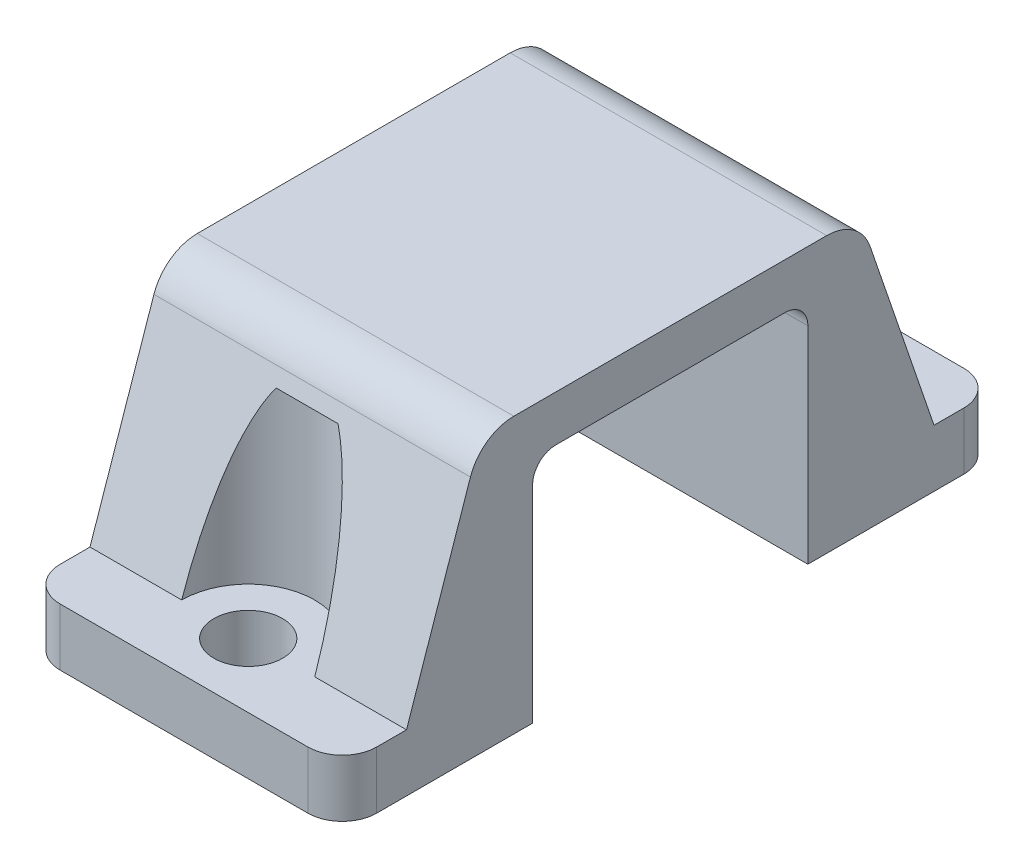
ISO-10303-21;
HEADER;
FILE_DESCRIPTION(('STEP AP214'),'2;1');
FILE_NAME('part.step','',(''),(''),'','','');
FILE_SCHEMA(('AUTOMOTIVE_DESIGN { 1 0 10303 214 1 1 1 1 }'));
ENDSEC;
DATA;
#1=APPLICATION_CONTEXT('core data for automotive mechanical design processes');
#2=APPLICATION_PROTOCOL_DEFINITION('international standard','automotive_design',2000,#1);
#3=PRODUCT_CONTEXT('',#1,'mechanical');
#4=PRODUCT('Part','Part','',(#3));
#5=PRODUCT_RELATED_PRODUCT_CATEGORY('part','',(#4));
#6=PRODUCT_DEFINITION_FORMATION('','',#4);
#7=PRODUCT_DEFINITION_CONTEXT('part definition',#1,'design');
#8=PRODUCT_DEFINITION('design','',#6,#7);
#9=PRODUCT_DEFINITION_SHAPE('','',#8);
#10=(LENGTH_UNIT() NAMED_UNIT(*) SI_UNIT(.MILLI.,.METRE.));
#11=(NAMED_UNIT(*) PLANE_ANGLE_UNIT() SI_UNIT($,.RADIAN.));
#12=(NAMED_UNIT(*) SI_UNIT($,.STERADIAN.) SOLID_ANGLE_UNIT());
#13=UNCERTAINTY_MEASURE_WITH_UNIT(LENGTH_MEASURE(1.E-05),#10,'distance_accuracy_value','');
#14=(GEOMETRIC_REPRESENTATION_CONTEXT(3) GLOBAL_UNCERTAINTY_ASSIGNED_CONTEXT((#13)) GLOBAL_UNIT_ASSIGNED_CONTEXT((#10,
#11,#12)) REPRESENTATION_CONTEXT('',''));
#15=CARTESIAN_POINT('',(0.,0.,0.));
#16=DIRECTION('',(0.,0.,1.));
#17=DIRECTION('',(1.,0.,0.));
#18=AXIS2_PLACEMENT_3D('',#15,#16,#17);
#19=CARTESIAN_POINT('',(13.8,0.,-6.));
#20=DIRECTION('',(0.,0.,-1.));
#21=DIRECTION('',(0.,1.,0.));
#22=AXIS2_PLACEMENT_3D('',#19,#20,#21);
#23=PLANE('',#22);
#24=DIRECTION('',(0.,-1.,0.));
#25=VECTOR('',#24,1.);
#26=CARTESIAN_POINT('',(13.8,0.,-6.));
#27=LINE('',#26,#25);
#28=CARTESIAN_POINT('',(13.8,-1.,-6.));
#29=VERTEX_POINT('',#28);
#30=CARTESIAN_POINT('',(13.8,-10.,-6.));
#31=VERTEX_POINT('',#30);
#32=EDGE_CURVE('E333',#29,#31,#27,.T.);
#33=ORIENTED_EDGE('',*,*,#32,.F.);
#34=DIRECTION('',(-1.,0.,0.));
#35=VECTOR('',#34,1.);
#36=CARTESIAN_POINT('',(0.,-1.,-6.));
#37=LINE('',#36,#35);
#38=CARTESIAN_POINT('',(0.,-1.,-6.));
#39=VERTEX_POINT('',#38);
#40=EDGE_CURVE('E258',#29,#39,#37,.T.);
#41=ORIENTED_EDGE('',*,*,#40,.T.);
#42=DIRECTION('',(0.,-1.,0.));
#43=VECTOR('',#42,1.);
#44=CARTESIAN_POINT('',(0.,0.,-6.));
#45=LINE('',#44,#43);
#46=CARTESIAN_POINT('',(0.,-10.,-6.));
#47=VERTEX_POINT('',#46);
#48=EDGE_CURVE('E359',#39,#47,#45,.T.);
#49=ORIENTED_EDGE('',*,*,#48,.T.);
#50=DIRECTION('',(-1.,0.,0.));
#51=VECTOR('',#50,1.);
#52=CARTESIAN_POINT('',(13.8,-10.,-6.));
#53=LINE('',#52,#51);
#54=EDGE_CURVE('E245',#31,#47,#53,.T.);
#55=ORIENTED_EDGE('',*,*,#54,.F.);
#56=EDGE_LOOP('',(#33,#41,#49,#55));
#57=FACE_BOUND('',#56,.T.);
#58=ADVANCED_FACE('F43',(#57),#23,.F.);
#59=CARTESIAN_POINT('',(13.8,-10.,-14.3));
#60=DIRECTION('',(0.,1.,0.));
#61=DIRECTION('',(0.,0.,1.));
#62=AXIS2_PLACEMENT_3D('',#59,#60,#61);
#63=PLANE('',#62);
#64=CARTESIAN_POINT('',(6.90000000000001,-9.99999999999999,-11.5));
#65=DIRECTION('',(0.,1.,0.));
#66=DIRECTION('',(0.,0.,1.));
#67=AXIS2_PLACEMENT_3D('',#64,#65,#66);
#68=CIRCLE('',#67,1.5);
#69=CARTESIAN_POINT('',(6.90000000000001,-9.99999999999999,-10.));
#70=VERTEX_POINT('',#69);
#71=EDGE_CURVE('E465',#70,#70,#68,.F.);
#72=ORIENTED_EDGE('',*,*,#71,.F.);
#73=EDGE_LOOP('',(#72));
#74=FACE_BOUND('',#73,.T.);
#75=DIRECTION('',(-1.,0.,0.));
#76=VECTOR('',#75,1.);
#77=CARTESIAN_POINT('',(13.8,-10.,-14.3));
#78=LINE('',#77,#76);
#79=CARTESIAN_POINT('',(12.3,-10.,-14.3));
#80=VERTEX_POINT('',#79);
#81=CARTESIAN_POINT('',(1.5,-10.,-14.3));
#82=VERTEX_POINT('',#81);
#83=EDGE_CURVE('E243',#80,#82,#78,.T.);
#84=ORIENTED_EDGE('',*,*,#83,.F.);
#85=CARTESIAN_POINT('',(12.3,-10.,-12.8));
#86=DIRECTION('',(0.,1.,0.));
#87=DIRECTION('',(0.,0.,1.));
#88=AXIS2_PLACEMENT_3D('',#85,#86,#87);
#89=CIRCLE('',#88,1.5);
#90=CARTESIAN_POINT('',(13.8,-10.,-12.8));
#91=VERTEX_POINT('',#90);
#92=EDGE_CURVE('E11',#80,#91,#89,.F.);
#93=ORIENTED_EDGE('',*,*,#92,.T.);
#94=DIRECTION('',(0.,0.,-1.));
#95=VECTOR('',#94,1.);
#96=CARTESIAN_POINT('',(13.8,-10.,-14.3));
#97=LINE('',#96,#95);
#98=EDGE_CURVE('E331',#31,#91,#97,.T.);
#99=ORIENTED_EDGE('',*,*,#98,.F.);
#100=ORIENTED_EDGE('',*,*,#54,.T.);
#101=DIRECTION('',(0.,0.,-1.));
#102=VECTOR('',#101,1.);
#103=CARTESIAN_POINT('',(0.,-10.,-14.3));
#104=LINE('',#103,#102);
#105=CARTESIAN_POINT('',(0.,-10.,-12.8));
#106=VERTEX_POINT('',#105);
#107=EDGE_CURVE('E361',#47,#106,#104,.T.);
#108=ORIENTED_EDGE('',*,*,#107,.T.);
#109=CARTESIAN_POINT('',(1.5,-10.,-12.8));
#110=DIRECTION('',(0.,1.,0.));
#111=DIRECTION('',(0.,0.,1.));
#112=AXIS2_PLACEMENT_3D('',#109,#110,#111);
#113=CIRCLE('',#112,1.5);
#114=EDGE_CURVE('E51',#106,#82,#113,.F.);
#115=ORIENTED_EDGE('',*,*,#114,.T.);
#116=EDGE_LOOP('',(#84,#93,#99,#100,#108,#115));
#117=FACE_BOUND('',#116,.T.);
#118=ADVANCED_FACE('F440',(#74,#117),#63,.F.);
#119=CARTESIAN_POINT('',(13.8,-10.,-14.3));
#120=DIRECTION('',(0.,0.,1.));
#121=DIRECTION('',(1.,0.,0.));
#122=AXIS2_PLACEMENT_3D('',#119,#120,#121);
#123=PLANE('',#122);
#124=DIRECTION('',(-1.,0.,0.));
#125=VECTOR('',#124,1.);
#126=CARTESIAN_POINT('',(13.8,-7.5,-14.3));
#127=LINE('',#126,#125);
#128=CARTESIAN_POINT('',(12.3,-7.5,-14.3));
#129=VERTEX_POINT('',#128);
#130=CARTESIAN_POINT('',(1.5,-7.5,-14.3));
#131=VERTEX_POINT('',#130);
#132=EDGE_CURVE('E235',#129,#131,#127,.T.);
#133=ORIENTED_EDGE('',*,*,#132,.F.);
#134=DIRECTION('',(0.,1.,0.));
#135=VECTOR('',#134,1.);
#136=CARTESIAN_POINT('',(12.3,-10.,-14.3));
#137=LINE('',#136,#135);
#138=EDGE_CURVE('E64',#129,#80,#137,.F.);
#139=ORIENTED_EDGE('',*,*,#138,.T.);
#140=ORIENTED_EDGE('',*,*,#83,.T.);
#141=DIRECTION('',(0.,1.,0.));
#142=VECTOR('',#141,1.);
#143=CARTESIAN_POINT('',(1.5,-7.5,-14.3));
#144=LINE('',#143,#142);
#145=EDGE_CURVE('E314',#82,#131,#144,.T.);
#146=ORIENTED_EDGE('',*,*,#145,.T.);
#147=EDGE_LOOP('',(#133,#139,#140,#146));
#148=FACE_BOUND('',#147,.T.);
#149=ADVANCED_FACE('F318',(#148),#123,.F.);
#150=CARTESIAN_POINT('',(13.8,-7.5,-14.3));
#151=DIRECTION('',(0.,-1.,0.));
#152=DIRECTION('',(0.,0.,-1.));
#153=AXIS2_PLACEMENT_3D('',#150,#151,#152);
#154=PLANE('',#153);
#155=DIRECTION('',(0.,0.,1.));
#156=VECTOR('',#155,1.);
#157=CARTESIAN_POINT('',(13.8,-7.5,-14.3));
#158=LINE('',#157,#156);
#159=CARTESIAN_POINT('',(13.8,-7.5,-12.8));
#160=VERTEX_POINT('',#159);
#161=CARTESIAN_POINT('',(13.8,-7.5,-11.5));
#162=VERTEX_POINT('',#161);
#163=EDGE_CURVE('E320',#160,#162,#158,.T.);
#164=ORIENTED_EDGE('',*,*,#163,.F.);
#165=CARTESIAN_POINT('',(12.3,-7.5,-12.8));
#166=DIRECTION('',(0.,-1.,0.));
#167=DIRECTION('',(0.,0.,-1.));
#168=AXIS2_PLACEMENT_3D('',#165,#166,#167);
#169=CIRCLE('',#168,1.5);
#170=EDGE_CURVE('E312',#160,#129,#169,.F.);
#171=ORIENTED_EDGE('',*,*,#170,.T.);
#172=ORIENTED_EDGE('',*,*,#132,.T.);
#173=CARTESIAN_POINT('',(1.5,-7.5,-12.8));
#174=DIRECTION('',(0.,-1.,0.));
#175=DIRECTION('',(0.,0.,-1.));
#176=AXIS2_PLACEMENT_3D('',#173,#174,#175);
#177=CIRCLE('',#176,1.5);
#178=CARTESIAN_POINT('',(0.,-7.5,-12.8));
#179=VERTEX_POINT('',#178);
#180=EDGE_CURVE('E310',#131,#179,#177,.F.);
#181=ORIENTED_EDGE('',*,*,#180,.T.);
#182=DIRECTION('',(0.,0.,1.));
#183=VECTOR('',#182,1.);
#184=CARTESIAN_POINT('',(0.,-7.5,-14.3));
#185=LINE('',#184,#183);
#186=CARTESIAN_POINT('',(0.,-7.5,-11.5));
#187=VERTEX_POINT('',#186);
#188=EDGE_CURVE('E231',#179,#187,#185,.T.);
#189=ORIENTED_EDGE('',*,*,#188,.T.);
#190=DIRECTION('',(-1.,0.,0.));
#191=VECTOR('',#190,1.);
#192=CARTESIAN_POINT('',(13.8,-7.5,-11.5));
#193=LINE('',#192,#191);
#194=CARTESIAN_POINT('',(4.00000000000001,-7.49999999999997,-11.5));
#195=VERTEX_POINT('',#194);
#196=EDGE_CURVE('E222',#195,#187,#193,.T.);
#197=ORIENTED_EDGE('',*,*,#196,.F.);
#198=CARTESIAN_POINT('',(6.90000000000001,-7.49999999999997,-11.5));
#199=DIRECTION('',(0.,-1.,0.));
#200=DIRECTION('',(0.,0.,-1.));
#201=AXIS2_PLACEMENT_3D('',#198,#199,#200);
#202=CIRCLE('',#201,2.9);
#203=CARTESIAN_POINT('',(9.80000000000001,-7.49999999999997,-11.5));
#204=VERTEX_POINT('',#203);
#205=EDGE_CURVE('E203',#195,#204,#202,.F.);
#206=ORIENTED_EDGE('',*,*,#205,.T.);
#207=EDGE_CURVE('E232',#162,#204,#193,.T.);
#208=ORIENTED_EDGE('',*,*,#207,.F.);
#209=EDGE_LOOP('',(#164,#171,#172,#181,#189,#197,#206,#208));
#210=FACE_BOUND('',#209,.T.);
#211=CARTESIAN_POINT('',(6.90000000000001,-7.5,-11.5));
#212=DIRECTION('',(0.,-1.,0.));
#213=DIRECTION('',(0.,0.,-1.));
#214=AXIS2_PLACEMENT_3D('',#211,#212,#213);
#215=CIRCLE('',#214,1.5);
#216=CARTESIAN_POINT('',(6.90000000000001,-7.5,-10.));
#217=VERTEX_POINT('',#216);
#218=EDGE_CURVE('E362',#217,#217,#215,.T.);
#219=ORIENTED_EDGE('',*,*,#218,.T.);
#220=EDGE_LOOP('',(#219));
#221=FACE_BOUND('',#220,.T.);
#222=ADVANCED_FACE('F228',(#210,#221),#154,.F.);
#223=CARTESIAN_POINT('',(13.8,2.,-8.25));
#224=DIRECTION('',(0.,-0.32368767906299,0.946163984953356));
#225=DIRECTION('',(0.,-0.946163984953356,-0.32368767906299));
#226=AXIS2_PLACEMENT_3D('',#223,#224,#225);
#227=PLANE('',#226);
#228=DIRECTION('',(0.,0.946163984953356,0.323687679062991));
#229=VECTOR('',#228,1.);
#230=CARTESIAN_POINT('',(0.,2.,-8.25));
#231=LINE('',#230,#229);
#232=CARTESIAN_POINT('',(0.,0.64737535812598,-8.71274000906216));
#233=VERTEX_POINT('',#232);
#234=EDGE_CURVE('E365',#187,#233,#231,.T.);
#235=ORIENTED_EDGE('',*,*,#234,.T.);
#236=DIRECTION('',(-1.,0.,0.));
#237=VECTOR('',#236,1.);
#238=CARTESIAN_POINT('',(13.8,0.64737535812598,-8.71274000906216));
#239=LINE('',#238,#237);
#240=CARTESIAN_POINT('',(13.8,0.64737535812598,-8.71274000906216));
#241=VERTEX_POINT('',#240);
#242=EDGE_CURVE('E278',#233,#241,#239,.F.);
#243=ORIENTED_EDGE('',*,*,#242,.T.);
#244=DIRECTION('',(0.,0.946163984953356,0.323687679062991));
#245=VECTOR('',#244,1.);
#246=CARTESIAN_POINT('',(13.8,2.,-8.25));
#247=LINE('',#246,#245);
#248=EDGE_CURVE('E336',#162,#241,#247,.T.);
#249=ORIENTED_EDGE('',*,*,#248,.F.);
#250=ORIENTED_EDGE('',*,*,#207,.T.);
#251=CARTESIAN_POINT('',(6.90000000000001,-7.49999999999999,-11.5));
#252=DIRECTION('',(0.,-0.32368767906299,0.946163984953356));
#253=DIRECTION('',(0.,0.946163984953356,0.32368767906299));
#254=AXIS2_PLACEMENT_3D('',#251,#252,#253);
#255=ELLIPSE('',#254,8.95925358788727,2.9);
#256=CARTESIAN_POINT('',(8.25156367838565,0.,-8.93421052631579));
#257=VERTEX_POINT('',#256);
#258=EDGE_CURVE('E210',#204,#257,#255,.T.);
#259=ORIENTED_EDGE('',*,*,#258,.T.);
#260=DIRECTION('',(-1.,0.,0.));
#261=VECTOR('',#260,1.);
#262=CARTESIAN_POINT('',(13.8,0.,-8.93421052631579));
#263=LINE('',#262,#261);
#264=CARTESIAN_POINT('',(5.54843632161437,0.,-8.93421052631579));
#265=VERTEX_POINT('',#264);
#266=EDGE_CURVE('E224',#257,#265,#263,.T.);
#267=ORIENTED_EDGE('',*,*,#266,.T.);
#268=EDGE_CURVE('E207',#265,#195,#255,.T.);
#269=ORIENTED_EDGE('',*,*,#268,.T.);
#270=ORIENTED_EDGE('',*,*,#196,.T.);
#271=EDGE_LOOP('',(#235,#243,#249,#250,#259,#267,#269,#270));
#272=FACE_BOUND('',#271,.T.);
#273=ADVANCED_FACE('F221',(#272),#227,.F.);
#274=CARTESIAN_POINT('',(13.8,2.,-8.25));
#275=DIRECTION('',(0.,-1.,0.));
#276=DIRECTION('',(0.,0.,-1.));
#277=AXIS2_PLACEMENT_3D('',#274,#275,#276);
#278=PLANE('',#277);
#279=DIRECTION('',(0.,0.,1.));
#280=VECTOR('',#279,1.);
#281=CARTESIAN_POINT('',(13.8,2.,-8.25));
#282=LINE('',#281,#280);
#283=CARTESIAN_POINT('',(13.8,2.,-6.82041203915545));
#284=VERTEX_POINT('',#283);
#285=CARTESIAN_POINT('',(13.8,2.,6.82041203915545));
#286=VERTEX_POINT('',#285);
#287=EDGE_CURVE('E343',#284,#286,#282,.T.);
#288=ORIENTED_EDGE('',*,*,#287,.F.);
#289=DIRECTION('',(-1.,0.,0.));
#290=VECTOR('',#289,1.);
#291=CARTESIAN_POINT('',(13.8,2.,-6.82041203915545));
#292=LINE('',#291,#290);
#293=CARTESIAN_POINT('',(0.,2.,-6.82041203915545));
#294=VERTEX_POINT('',#293);
#295=EDGE_CURVE('E271',#284,#294,#292,.T.);
#296=ORIENTED_EDGE('',*,*,#295,.T.);
#297=DIRECTION('',(0.,0.,1.));
#298=VECTOR('',#297,1.);
#299=CARTESIAN_POINT('',(0.,2.,-8.25));
#300=LINE('',#299,#298);
#301=CARTESIAN_POINT('',(0.,2.,6.82041203915545));
#302=VERTEX_POINT('',#301);
#303=EDGE_CURVE('E367',#294,#302,#300,.T.);
#304=ORIENTED_EDGE('',*,*,#303,.T.);
#305=DIRECTION('',(-1.,0.,0.));
#306=VECTOR('',#305,1.);
#307=CARTESIAN_POINT('',(13.8,2.,6.82041203915545));
#308=LINE('',#307,#306);
#309=EDGE_CURVE('E269',#302,#286,#308,.F.);
#310=ORIENTED_EDGE('',*,*,#309,.T.);
#311=EDGE_LOOP('',(#288,#296,#304,#310));
#312=FACE_BOUND('',#311,.T.);
#313=ADVANCED_FACE('F452',(#312),#278,.F.);
#314=CARTESIAN_POINT('',(13.8,2.,8.25));
#315=DIRECTION('',(0.,-0.32368767906299,-0.946163984953356));
#316=DIRECTION('',(0.,0.946163984953356,-0.32368767906299));
#317=AXIS2_PLACEMENT_3D('',#314,#315,#316);
#318=PLANE('',#317);
#319=DIRECTION('',(0.,-0.946163984953356,0.32368767906299));
#320=VECTOR('',#319,1.);
#321=CARTESIAN_POINT('',(13.8,2.,8.25));
#322=LINE('',#321,#320);
#323=CARTESIAN_POINT('',(13.8,0.64737535812598,8.71274000906216));
#324=VERTEX_POINT('',#323);
#325=CARTESIAN_POINT('',(13.8,-7.5,11.5));
#326=VERTEX_POINT('',#325);
#327=EDGE_CURVE('E346',#324,#326,#322,.T.);
#328=ORIENTED_EDGE('',*,*,#327,.F.);
#329=DIRECTION('',(-1.,0.,0.));
#330=VECTOR('',#329,1.);
#331=CARTESIAN_POINT('',(13.8,0.647375358125979,8.71274000906216));
#332=LINE('',#331,#330);
#333=CARTESIAN_POINT('',(0.,0.64737535812598,8.71274000906216));
#334=VERTEX_POINT('',#333);
#335=EDGE_CURVE('E284',#324,#334,#332,.T.);
#336=ORIENTED_EDGE('',*,*,#335,.T.);
#337=DIRECTION('',(0.,-0.946163984953356,0.32368767906299));
#338=VECTOR('',#337,1.);
#339=CARTESIAN_POINT('',(0.,2.,8.25));
#340=LINE('',#339,#338);
#341=CARTESIAN_POINT('',(0.,-7.5,11.5));
#342=VERTEX_POINT('',#341);
#343=EDGE_CURVE('E370',#334,#342,#340,.T.);
#344=ORIENTED_EDGE('',*,*,#343,.T.);
#345=DIRECTION('',(-1.,0.,0.));
#346=VECTOR('',#345,1.);
#347=CARTESIAN_POINT('',(13.8,-7.5,11.5));
#348=LINE('',#347,#346);
#349=CARTESIAN_POINT('',(4.00000000000001,-7.5,11.5));
#350=VERTEX_POINT('',#349);
#351=EDGE_CURVE('E237',#350,#342,#348,.T.);
#352=ORIENTED_EDGE('',*,*,#351,.F.);
#353=CARTESIAN_POINT('',(6.90000000000001,-7.50000000000001,11.5));
#354=DIRECTION('',(0.,-0.32368767906299,-0.946163984953356));
#355=DIRECTION('',(0.,0.946163984953356,-0.32368767906299));
#356=AXIS2_PLACEMENT_3D('',#353,#354,#355);
#357=ELLIPSE('',#356,8.95925358788729,2.9);
#358=CARTESIAN_POINT('',(5.54843632161437,0.,8.93421052631579));
#359=VERTEX_POINT('',#358);
#360=EDGE_CURVE('E466',#350,#359,#357,.T.);
#361=ORIENTED_EDGE('',*,*,#360,.T.);
#362=DIRECTION('',(1.,0.,0.));
#363=VECTOR('',#362,1.);
#364=CARTESIAN_POINT('',(13.8,0.,8.93421052631579));
#365=LINE('',#364,#363);
#366=CARTESIAN_POINT('',(8.25156367838564,0.,8.93421052631579));
#367=VERTEX_POINT('',#366);
#368=EDGE_CURVE('E248',#359,#367,#365,.T.);
#369=ORIENTED_EDGE('',*,*,#368,.T.);
#370=CARTESIAN_POINT('',(9.80000000000001,-7.5,11.5));
#371=VERTEX_POINT('',#370);
#372=EDGE_CURVE('E461',#367,#371,#357,.T.);
#373=ORIENTED_EDGE('',*,*,#372,.T.);
#374=EDGE_CURVE('E233',#326,#371,#348,.T.);
#375=ORIENTED_EDGE('',*,*,#374,.F.);
#376=EDGE_LOOP('',(#328,#336,#344,#352,#361,#369,#373,#375));
#377=FACE_BOUND('',#376,.T.);
#378=ADVANCED_FACE('F459',(#377),#318,.F.);
#379=CARTESIAN_POINT('',(13.8,-7.5,14.3));
#380=DIRECTION('',(0.,-1.,0.));
#381=DIRECTION('',(0.,0.,-1.));
#382=AXIS2_PLACEMENT_3D('',#379,#380,#381);
#383=PLANE('',#382);
#384=CARTESIAN_POINT('',(6.90000000000001,-7.5,11.5));
#385=DIRECTION('',(0.,-1.,0.));
#386=DIRECTION('',(0.,0.,-1.));
#387=AXIS2_PLACEMENT_3D('',#384,#385,#386);
#388=CIRCLE('',#387,1.5);
#389=CARTESIAN_POINT('',(6.90000000000001,-7.5,13.));
#390=VERTEX_POINT('',#389);
#391=EDGE_CURVE('E475',#390,#390,#388,.T.);
#392=ORIENTED_EDGE('',*,*,#391,.T.);
#393=EDGE_LOOP('',(#392));
#394=FACE_BOUND('',#393,.T.);
#395=DIRECTION('',(0.,0.,1.));
#396=VECTOR('',#395,1.);
#397=CARTESIAN_POINT('',(0.,-7.5,14.3));
#398=LINE('',#397,#396);
#399=CARTESIAN_POINT('',(0.,-7.5,12.8));
#400=VERTEX_POINT('',#399);
#401=EDGE_CURVE('E372',#342,#400,#398,.T.);
#402=ORIENTED_EDGE('',*,*,#401,.T.);
#403=CARTESIAN_POINT('',(1.5,-7.5,12.8));
#404=DIRECTION('',(0.,-1.,0.));
#405=DIRECTION('',(0.,0.,-1.));
#406=AXIS2_PLACEMENT_3D('',#403,#404,#405);
#407=CIRCLE('',#406,1.5);
#408=CARTESIAN_POINT('',(1.5,-7.5,14.3));
#409=VERTEX_POINT('',#408);
#410=EDGE_CURVE('E302',#400,#409,#407,.F.);
#411=ORIENTED_EDGE('',*,*,#410,.T.);
#412=DIRECTION('',(-1.,0.,0.));
#413=VECTOR('',#412,1.);
#414=CARTESIAN_POINT('',(13.8,-7.5,14.3));
#415=LINE('',#414,#413);
#416=CARTESIAN_POINT('',(12.3,-7.5,14.3));
#417=VERTEX_POINT('',#416);
#418=EDGE_CURVE('E386',#417,#409,#415,.T.);
#419=ORIENTED_EDGE('',*,*,#418,.F.);
#420=CARTESIAN_POINT('',(12.3,-7.5,12.8));
#421=DIRECTION('',(0.,-1.,0.));
#422=DIRECTION('',(0.,0.,-1.));
#423=AXIS2_PLACEMENT_3D('',#420,#421,#422);
#424=CIRCLE('',#423,1.5);
#425=CARTESIAN_POINT('',(13.8,-7.5,12.8));
#426=VERTEX_POINT('',#425);
#427=EDGE_CURVE('E300',#417,#426,#424,.F.);
#428=ORIENTED_EDGE('',*,*,#427,.T.);
#429=DIRECTION('',(0.,0.,1.));
#430=VECTOR('',#429,1.);
#431=CARTESIAN_POINT('',(13.8,-7.5,14.3));
#432=LINE('',#431,#430);
#433=EDGE_CURVE('E348',#326,#426,#432,.T.);
#434=ORIENTED_EDGE('',*,*,#433,.F.);
#435=ORIENTED_EDGE('',*,*,#374,.T.);
#436=CARTESIAN_POINT('',(6.90000000000001,-7.5,11.5));
#437=DIRECTION('',(0.,-1.,0.));
#438=DIRECTION('',(0.,0.,-1.));
#439=AXIS2_PLACEMENT_3D('',#436,#437,#438);
#440=CIRCLE('',#439,2.9);
#441=EDGE_CURVE('E398',#371,#350,#440,.F.);
#442=ORIENTED_EDGE('',*,*,#441,.T.);
#443=ORIENTED_EDGE('',*,*,#351,.T.);
#444=EDGE_LOOP('',(#402,#411,#419,#428,#434,#435,#442,#443));
#445=FACE_BOUND('',#444,.T.);
#446=ADVANCED_FACE('F396',(#394,#445),#383,.F.);
#447=CARTESIAN_POINT('',(13.8,-10.,14.3));
#448=DIRECTION('',(0.,0.,-1.));
#449=DIRECTION('',(-1.,0.,0.));
#450=AXIS2_PLACEMENT_3D('',#447,#448,#449);
#451=PLANE('',#450);
#452=ORIENTED_EDGE('',*,*,#418,.T.);
#453=DIRECTION('',(0.,-1.,0.));
#454=VECTOR('',#453,1.);
#455=CARTESIAN_POINT('',(1.5,-10.,14.3));
#456=LINE('',#455,#454);
#457=CARTESIAN_POINT('',(1.5,-10.,14.3));
#458=VERTEX_POINT('',#457);
#459=EDGE_CURVE('E289',#409,#458,#456,.T.);
#460=ORIENTED_EDGE('',*,*,#459,.T.);
#461=DIRECTION('',(-1.,0.,0.));
#462=VECTOR('',#461,1.);
#463=CARTESIAN_POINT('',(13.8,-10.,14.3));
#464=LINE('',#463,#462);
#465=CARTESIAN_POINT('',(12.3,-10.,14.3));
#466=VERTEX_POINT('',#465);
#467=EDGE_CURVE('E384',#466,#458,#464,.T.);
#468=ORIENTED_EDGE('',*,*,#467,.F.);
#469=DIRECTION('',(0.,-1.,0.));
#470=VECTOR('',#469,1.);
#471=CARTESIAN_POINT('',(12.3,-10.,14.3));
#472=LINE('',#471,#470);
#473=EDGE_CURVE('E287',#466,#417,#472,.F.);
#474=ORIENTED_EDGE('',*,*,#473,.T.);
#475=EDGE_LOOP('',(#452,#460,#468,#474));
#476=FACE_BOUND('',#475,.T.);
#477=ADVANCED_FACE('F611',(#476),#451,.F.);
#478=CARTESIAN_POINT('',(13.8,-10.,6.));
#479=DIRECTION('',(0.,1.,0.));
#480=DIRECTION('',(0.,0.,1.));
#481=AXIS2_PLACEMENT_3D('',#478,#479,#480);
#482=PLANE('',#481);
#483=CARTESIAN_POINT('',(6.90000000000001,-10.,11.5));
#484=DIRECTION('',(0.,1.,0.));
#485=DIRECTION('',(0.,0.,1.));
#486=AXIS2_PLACEMENT_3D('',#483,#484,#485);
#487=CIRCLE('',#486,1.5);
#488=CARTESIAN_POINT('',(6.90000000000001,-10.,13.));
#489=VERTEX_POINT('',#488);
#490=EDGE_CURVE('E469',#489,#489,#487,.F.);
#491=ORIENTED_EDGE('',*,*,#490,.F.);
#492=EDGE_LOOP('',(#491));
#493=FACE_BOUND('',#492,.T.);
#494=ORIENTED_EDGE('',*,*,#467,.T.);
#495=CARTESIAN_POINT('',(1.5,-10.,12.8));
#496=DIRECTION('',(0.,1.,0.));
#497=DIRECTION('',(0.,0.,1.));
#498=AXIS2_PLACEMENT_3D('',#495,#496,#497);
#499=CIRCLE('',#498,1.5);
#500=CARTESIAN_POINT('',(0.,-10.,12.8));
#501=VERTEX_POINT('',#500);
#502=EDGE_CURVE('E294',#458,#501,#499,.F.);
#503=ORIENTED_EDGE('',*,*,#502,.T.);
#504=DIRECTION('',(0.,0.,-1.));
#505=VECTOR('',#504,1.);
#506=CARTESIAN_POINT('',(0.,-10.,6.));
#507=LINE('',#506,#505);
#508=CARTESIAN_POINT('',(0.,-10.,6.));
#509=VERTEX_POINT('',#508);
#510=EDGE_CURVE('E375',#501,#509,#507,.T.);
#511=ORIENTED_EDGE('',*,*,#510,.T.);
#512=DIRECTION('',(-1.,0.,0.));
#513=VECTOR('',#512,1.);
#514=CARTESIAN_POINT('',(13.8,-10.,6.));
#515=LINE('',#514,#513);
#516=CARTESIAN_POINT('',(13.8,-10.,6.));
#517=VERTEX_POINT('',#516);
#518=EDGE_CURVE('E358',#517,#509,#515,.T.);
#519=ORIENTED_EDGE('',*,*,#518,.F.);
#520=DIRECTION('',(0.,0.,-1.));
#521=VECTOR('',#520,1.);
#522=CARTESIAN_POINT('',(13.8,-10.,6.));
#523=LINE('',#522,#521);
#524=CARTESIAN_POINT('',(13.8,-10.,12.8));
#525=VERTEX_POINT('',#524);
#526=EDGE_CURVE('E350',#525,#517,#523,.T.);
#527=ORIENTED_EDGE('',*,*,#526,.F.);
#528=CARTESIAN_POINT('',(12.3,-10.,12.8));
#529=DIRECTION('',(0.,1.,0.));
#530=DIRECTION('',(0.,0.,1.));
#531=AXIS2_PLACEMENT_3D('',#528,#529,#530);
#532=CIRCLE('',#531,1.5);
#533=EDGE_CURVE('E292',#525,#466,#532,.F.);
#534=ORIENTED_EDGE('',*,*,#533,.T.);
#535=EDGE_LOOP('',(#494,#503,#511,#519,#527,#534));
#536=FACE_BOUND('',#535,.T.);
#537=ADVANCED_FACE('F418',(#493,#536),#482,.F.);
#538=CARTESIAN_POINT('',(13.8,0.,6.));
#539=DIRECTION('',(0.,0.,1.));
#540=DIRECTION('',(0.,-1.,0.));
#541=AXIS2_PLACEMENT_3D('',#538,#539,#540);
#542=PLANE('',#541);
#543=DIRECTION('',(0.,1.,0.));
#544=VECTOR('',#543,1.);
#545=CARTESIAN_POINT('',(0.,0.,6.));
#546=LINE('',#545,#544);
#547=CARTESIAN_POINT('',(0.,-1.,6.));
#548=VERTEX_POINT('',#547);
#549=EDGE_CURVE('E377',#509,#548,#546,.T.);
#550=ORIENTED_EDGE('',*,*,#549,.T.);
#551=DIRECTION('',(-1.,0.,0.));
#552=VECTOR('',#551,1.);
#553=CARTESIAN_POINT('',(13.8,-1.,6.));
#554=LINE('',#553,#552);
#555=CARTESIAN_POINT('',(13.8,-1.,6.));
#556=VERTEX_POINT('',#555);
#557=EDGE_CURVE('E256',#548,#556,#554,.F.);
#558=ORIENTED_EDGE('',*,*,#557,.T.);
#559=DIRECTION('',(0.,1.,0.));
#560=VECTOR('',#559,1.);
#561=CARTESIAN_POINT('',(13.8,0.,6.));
#562=LINE('',#561,#560);
#563=EDGE_CURVE('E352',#517,#556,#562,.T.);
#564=ORIENTED_EDGE('',*,*,#563,.F.);
#565=ORIENTED_EDGE('',*,*,#518,.T.);
#566=EDGE_LOOP('',(#550,#558,#564,#565));
#567=FACE_BOUND('',#566,.T.);
#568=ADVANCED_FACE('F422',(#567),#542,.F.);
#569=CARTESIAN_POINT('',(13.8,0.,6.));
#570=DIRECTION('',(0.,1.,0.));
#571=DIRECTION('',(0.,0.,1.));
#572=AXIS2_PLACEMENT_3D('',#569,#570,#571);
#573=PLANE('',#572);
#574=DIRECTION('',(0.,0.,-1.));
#575=VECTOR('',#574,1.);
#576=CARTESIAN_POINT('',(13.8,0.,6.));
#577=LINE('',#576,#575);
#578=CARTESIAN_POINT('',(13.8,0.,5.));
#579=VERTEX_POINT('',#578);
#580=CARTESIAN_POINT('',(13.8,0.,-5.));
#581=VERTEX_POINT('',#580);
#582=EDGE_CURVE('E355',#579,#581,#577,.T.);
#583=ORIENTED_EDGE('',*,*,#582,.F.);
#584=DIRECTION('',(-1.,0.,0.));
#585=VECTOR('',#584,1.);
#586=CARTESIAN_POINT('',(0.,0.,5.));
#587=LINE('',#586,#585);
#588=CARTESIAN_POINT('',(0.,0.,5.));
#589=VERTEX_POINT('',#588);
#590=EDGE_CURVE('E253',#579,#589,#587,.T.);
#591=ORIENTED_EDGE('',*,*,#590,.T.);
#592=DIRECTION('',(0.,0.,-1.));
#593=VECTOR('',#592,1.);
#594=CARTESIAN_POINT('',(0.,0.,6.));
#595=LINE('',#594,#593);
#596=CARTESIAN_POINT('',(0.,0.,-5.));
#597=VERTEX_POINT('',#596);
#598=EDGE_CURVE('E338',#589,#597,#595,.T.);
#599=ORIENTED_EDGE('',*,*,#598,.T.);
#600=DIRECTION('',(-1.,0.,0.));
#601=VECTOR('',#600,1.);
#602=CARTESIAN_POINT('',(13.8,0.,-5.));
#603=LINE('',#602,#601);
#604=EDGE_CURVE('E225',#597,#581,#603,.F.);
#605=ORIENTED_EDGE('',*,*,#604,.T.);
#606=EDGE_LOOP('',(#583,#591,#599,#605));
#607=FACE_BOUND('',#606,.T.);
#608=ADVANCED_FACE('F431',(#607),#573,.F.);
#609=CARTESIAN_POINT('',(13.8,0.,0.));
#610=DIRECTION('',(-1.,0.,0.));
#611=DIRECTION('',(0.,0.,1.));
#612=AXIS2_PLACEMENT_3D('',#609,#610,#611);
#613=PLANE('',#612);
#614=ORIENTED_EDGE('',*,*,#433,.T.);
#615=DIRECTION('',(0.,-1.,0.));
#616=VECTOR('',#615,1.);
#617=CARTESIAN_POINT('',(13.8,0.,12.8));
#618=LINE('',#617,#616);
#619=EDGE_CURVE('E307',#426,#525,#618,.T.);
#620=ORIENTED_EDGE('',*,*,#619,.T.);
#621=ORIENTED_EDGE('',*,*,#526,.T.);
#622=ORIENTED_EDGE('',*,*,#563,.T.);
#623=CARTESIAN_POINT('',(13.8,-1.,5.));
#624=DIRECTION('',(-1.,0.,0.));
#625=DIRECTION('',(0.,0.,1.));
#626=AXIS2_PLACEMENT_3D('',#623,#624,#625);
#627=CIRCLE('',#626,1.);
#628=EDGE_CURVE('E263',#556,#579,#627,.T.);
#629=ORIENTED_EDGE('',*,*,#628,.T.);
#630=ORIENTED_EDGE('',*,*,#582,.T.);
#631=CARTESIAN_POINT('',(13.8,-1.,-5.));
#632=DIRECTION('',(-1.,0.,0.));
#633=DIRECTION('',(0.,0.,1.));
#634=AXIS2_PLACEMENT_3D('',#631,#632,#633);
#635=CIRCLE('',#634,1.);
#636=EDGE_CURVE('E267',#581,#29,#635,.T.);
#637=ORIENTED_EDGE('',*,*,#636,.T.);
#638=ORIENTED_EDGE('',*,*,#32,.T.);
#639=ORIENTED_EDGE('',*,*,#98,.T.);
#640=DIRECTION('',(0.,1.,0.));
#641=VECTOR('',#640,1.);
#642=CARTESIAN_POINT('',(13.8,0.,-12.8));
#643=LINE('',#642,#641);
#644=EDGE_CURVE('E304',#91,#160,#643,.T.);
#645=ORIENTED_EDGE('',*,*,#644,.T.);
#646=ORIENTED_EDGE('',*,*,#163,.T.);
#647=ORIENTED_EDGE('',*,*,#248,.T.);
#648=CARTESIAN_POINT('',(13.8,0.,-6.82041203915545));
#649=DIRECTION('',(-1.,0.,0.));
#650=DIRECTION('',(0.,0.,1.));
#651=AXIS2_PLACEMENT_3D('',#648,#649,#650);
#652=CIRCLE('',#651,2.);
#653=EDGE_CURVE('E282',#241,#284,#652,.F.);
#654=ORIENTED_EDGE('',*,*,#653,.T.);
#655=ORIENTED_EDGE('',*,*,#287,.T.);
#656=CARTESIAN_POINT('',(13.8,0.,6.82041203915545));
#657=DIRECTION('',(-1.,0.,0.));
#658=DIRECTION('',(0.,0.,1.));
#659=AXIS2_PLACEMENT_3D('',#656,#657,#658);
#660=CIRCLE('',#659,2.);
#661=EDGE_CURVE('E280',#286,#324,#660,.F.);
#662=ORIENTED_EDGE('',*,*,#661,.T.);
#663=ORIENTED_EDGE('',*,*,#327,.T.);
#664=EDGE_LOOP('',(#614,#620,#621,#622,#629,#630,#637,#638,#639,#645,#646,#647,#654,#655,#662,#663));
#665=FACE_BOUND('',#664,.T.);
#666=ADVANCED_FACE('F328',(#665),#613,.F.);
#667=CARTESIAN_POINT('',(0.,0.,0.));
#668=DIRECTION('',(-1.,0.,0.));
#669=DIRECTION('',(0.,0.,1.));
#670=AXIS2_PLACEMENT_3D('',#667,#668,#669);
#671=PLANE('',#670);
#672=ORIENTED_EDGE('',*,*,#510,.F.);
#673=DIRECTION('',(0.,-1.,0.));
#674=VECTOR('',#673,1.);
#675=CARTESIAN_POINT('',(0.,-7.5,12.8));
#676=LINE('',#675,#674);
#677=EDGE_CURVE('E298',#501,#400,#676,.F.);
#678=ORIENTED_EDGE('',*,*,#677,.T.);
#679=ORIENTED_EDGE('',*,*,#401,.F.);
#680=ORIENTED_EDGE('',*,*,#343,.F.);
#681=CARTESIAN_POINT('',(0.,0.,6.82041203915545));
#682=DIRECTION('',(-1.,0.,0.));
#683=DIRECTION('',(0.,0.,1.));
#684=AXIS2_PLACEMENT_3D('',#681,#682,#683);
#685=CIRCLE('',#684,2.);
#686=EDGE_CURVE('E274',#334,#302,#685,.T.);
#687=ORIENTED_EDGE('',*,*,#686,.T.);
#688=ORIENTED_EDGE('',*,*,#303,.F.);
#689=CARTESIAN_POINT('',(0.,0.,-6.82041203915545));
#690=DIRECTION('',(-1.,0.,0.));
#691=DIRECTION('',(0.,0.,1.));
#692=AXIS2_PLACEMENT_3D('',#689,#690,#691);
#693=CIRCLE('',#692,2.);
#694=EDGE_CURVE('E276',#294,#233,#693,.T.);
#695=ORIENTED_EDGE('',*,*,#694,.T.);
#696=ORIENTED_EDGE('',*,*,#234,.F.);
#697=ORIENTED_EDGE('',*,*,#188,.F.);
#698=DIRECTION('',(0.,1.,0.));
#699=VECTOR('',#698,1.);
#700=CARTESIAN_POINT('',(0.,-10.,-12.8));
#701=LINE('',#700,#699);
#702=EDGE_CURVE('E296',#179,#106,#701,.F.);
#703=ORIENTED_EDGE('',*,*,#702,.T.);
#704=ORIENTED_EDGE('',*,*,#107,.F.);
#705=ORIENTED_EDGE('',*,*,#48,.F.);
#706=CARTESIAN_POINT('',(0.,-1.,-5.));
#707=DIRECTION('',(-1.,0.,0.));
#708=DIRECTION('',(0.,0.,1.));
#709=AXIS2_PLACEMENT_3D('',#706,#707,#708);
#710=CIRCLE('',#709,1.);
#711=EDGE_CURVE('E265',#39,#597,#710,.F.);
#712=ORIENTED_EDGE('',*,*,#711,.T.);
#713=ORIENTED_EDGE('',*,*,#598,.F.);
#714=CARTESIAN_POINT('',(0.,-1.,5.));
#715=DIRECTION('',(-1.,0.,0.));
#716=DIRECTION('',(0.,0.,1.));
#717=AXIS2_PLACEMENT_3D('',#714,#715,#716);
#718=CIRCLE('',#717,1.);
#719=EDGE_CURVE('E261',#589,#548,#718,.F.);
#720=ORIENTED_EDGE('',*,*,#719,.T.);
#721=ORIENTED_EDGE('',*,*,#549,.F.);
#722=EDGE_LOOP('',(#672,#678,#679,#680,#687,#688,#695,#696,#697,#703,#704,#705,#712,#713,#720,#721));
#723=FACE_BOUND('',#722,.T.);
#724=ADVANCED_FACE('F404',(#723),#671,.T.);
#725=CARTESIAN_POINT('',(6.90000000000001,-14.2426406871193,11.5));
#726=DIRECTION('',(0.,1.,0.));
#727=DIRECTION('',(0.,0.,1.));
#728=AXIS2_PLACEMENT_3D('',#725,#726,#727);
#729=CYLINDRICAL_SURFACE('',#728,1.5);
#730=CARTESIAN_POINT('',(6.90000000000001,-10.,13.));
#731=CARTESIAN_POINT('',(6.90000000000001,-9.97395833333334,13.));
#732=CARTESIAN_POINT('',(6.90000000000001,-9.94791666666667,13.));
#733=CARTESIAN_POINT('',(6.90000000000001,-9.89583333333334,13.));
#734=CARTESIAN_POINT('',(6.90000000000001,-9.86979166666667,13.));
#735=CARTESIAN_POINT('',(6.90000000000001,-9.81770833333334,13.));
#736=CARTESIAN_POINT('',(6.90000000000001,-9.79166666666667,13.));
#737=CARTESIAN_POINT('',(6.90000000000001,-9.73958333333334,13.));
#738=CARTESIAN_POINT('',(6.90000000000001,-9.71354166666667,13.));
#739=CARTESIAN_POINT('',(6.90000000000001,-9.66145833333334,13.));
#740=CARTESIAN_POINT('',(6.90000000000001,-9.63541666666667,13.));
#741=CARTESIAN_POINT('',(6.90000000000001,-9.58333333333334,13.));
#742=CARTESIAN_POINT('',(6.90000000000001,-9.55729166666667,13.));
#743=CARTESIAN_POINT('',(6.90000000000001,-9.50520833333334,13.));
#744=CARTESIAN_POINT('',(6.90000000000001,-9.47916666666667,13.));
#745=CARTESIAN_POINT('',(6.90000000000001,-9.42708333333334,13.));
#746=CARTESIAN_POINT('',(6.90000000000001,-9.40104166666667,13.));
#747=CARTESIAN_POINT('',(6.90000000000001,-9.34895833333334,13.));
#748=CARTESIAN_POINT('',(6.90000000000001,-9.32291666666667,13.));
#749=CARTESIAN_POINT('',(6.90000000000001,-9.27083333333334,13.));
#750=CARTESIAN_POINT('',(6.90000000000001,-9.24479166666667,13.));
#751=CARTESIAN_POINT('',(6.90000000000001,-9.19270833333334,13.));
#752=CARTESIAN_POINT('',(6.90000000000001,-9.16666666666667,13.));
#753=CARTESIAN_POINT('',(6.90000000000001,-9.11458333333334,13.));
#754=CARTESIAN_POINT('',(6.90000000000001,-9.08854166666667,13.));
#755=CARTESIAN_POINT('',(6.90000000000001,-9.03645833333334,13.));
#756=CARTESIAN_POINT('',(6.90000000000001,-9.01041666666667,13.));
#757=CARTESIAN_POINT('',(6.90000000000001,-8.95833333333334,13.));
#758=CARTESIAN_POINT('',(6.90000000000001,-8.93229166666667,13.));
#759=CARTESIAN_POINT('',(6.90000000000001,-8.88020833333334,13.));
#760=CARTESIAN_POINT('',(6.90000000000001,-8.85416666666667,13.));
#761=CARTESIAN_POINT('',(6.90000000000001,-8.80208333333334,13.));
#762=CARTESIAN_POINT('',(6.90000000000001,-8.77604166666667,13.));
#763=CARTESIAN_POINT('',(6.90000000000001,-8.72395833333334,13.));
#764=CARTESIAN_POINT('',(6.90000000000001,-8.69791666666667,13.));
#765=CARTESIAN_POINT('',(6.90000000000001,-8.64583333333334,13.));
#766=CARTESIAN_POINT('',(6.90000000000001,-8.61979166666667,13.));
#767=CARTESIAN_POINT('',(6.90000000000001,-8.56770833333334,13.));
#768=CARTESIAN_POINT('',(6.90000000000001,-8.54166666666667,13.));
#769=CARTESIAN_POINT('',(6.90000000000001,-8.48958333333334,13.));
#770=CARTESIAN_POINT('',(6.90000000000001,-8.46354166666667,13.));
#771=CARTESIAN_POINT('',(6.90000000000001,-8.41145833333334,13.));
#772=CARTESIAN_POINT('',(6.90000000000001,-8.38541666666667,13.));
#773=CARTESIAN_POINT('',(6.90000000000001,-8.33333333333334,13.));
#774=CARTESIAN_POINT('',(6.90000000000001,-8.30729166666667,13.));
#775=CARTESIAN_POINT('',(6.90000000000001,-8.25520833333334,13.));
#776=CARTESIAN_POINT('',(6.90000000000001,-8.22916666666667,13.));
#777=CARTESIAN_POINT('',(6.90000000000001,-8.17708333333334,13.));
#778=CARTESIAN_POINT('',(6.90000000000001,-8.15104166666667,13.));
#779=CARTESIAN_POINT('',(6.90000000000001,-8.09895833333334,13.));
#780=CARTESIAN_POINT('',(6.90000000000001,-8.07291666666667,13.));
#781=CARTESIAN_POINT('',(6.90000000000001,-8.02083333333334,13.));
#782=CARTESIAN_POINT('',(6.90000000000001,-7.99479166666667,13.));
#783=CARTESIAN_POINT('',(6.90000000000001,-7.94270833333334,13.));
#784=CARTESIAN_POINT('',(6.90000000000001,-7.91666666666667,13.));
#785=CARTESIAN_POINT('',(6.90000000000001,-7.86458333333334,13.));
#786=CARTESIAN_POINT('',(6.90000000000001,-7.83854166666667,13.));
#787=CARTESIAN_POINT('',(6.90000000000001,-7.78645833333334,13.));
#788=CARTESIAN_POINT('',(6.90000000000001,-7.76041666666667,13.));
#789=CARTESIAN_POINT('',(6.90000000000001,-7.70833333333334,13.));
#790=CARTESIAN_POINT('',(6.90000000000001,-7.68229166666667,13.));
#791=CARTESIAN_POINT('',(6.90000000000001,-7.63020833333334,13.));
#792=CARTESIAN_POINT('',(6.90000000000001,-7.60416666666667,13.));
#793=CARTESIAN_POINT('',(6.90000000000001,-7.55208333333334,13.));
#794=CARTESIAN_POINT('',(6.90000000000001,-7.52604166666667,13.));
#795=CARTESIAN_POINT('',(6.90000000000001,-7.5,13.));
#796=B_SPLINE_CURVE_WITH_KNOTS('',3,(#730,#731,#732,#733,#734,#735,#736,#737,#738,#739,#740,
#741,#742,#743,#744,#745,#746,#747,#748,#749,#750,#751,#752,#753,#754,#755,#756,#757,#758,#759,
#760,#761,#762,#763,#764,#765,#766,#767,#768,#769,#770,#771,#772,#773,#774,#775,#776,#777,#778,
#779,#780,#781,#782,#783,#784,#785,#786,#787,#788,#789,#790,#791,#792,#793,#794,#795),
.UNSPECIFIED.,.F.,.F.,(4,2,2,2,2,2,2,2,2,2,2,2,2,2,2,2,2,2,2,2,2,2,2,2,2,2,2,2,2,2,2,2,4),(0.,
0.0781250000000001,0.15625,0.234375,0.3125,0.390625,0.46875,0.546875,0.625000000000001,
0.703125000000001,0.781249999999999,0.859375000000001,0.937499999999999,1.015625,1.09375,
1.171875,1.25,1.328125,1.40625,1.484375,1.5625,1.640625,1.71875,1.796875,1.875,1.953125,2.03125,
2.109375,2.1875,2.265625,2.34375,2.421875,2.5),.UNSPECIFIED.);
#797=EDGE_CURVE('BSEAM484',#489,#390,#796,.T.);
#798=ORIENTED_EDGE('',*,*,#490,.T.);
#799=ORIENTED_EDGE('',*,*,#391,.F.);
#800=ORIENTED_EDGE('',*,*,#797,.T.);
#801=ORIENTED_EDGE('',*,*,#797,.F.);
#802=EDGE_LOOP('',(#798,#800,#799,#801));
#803=FACE_BOUND('',#802,.T.);
#804=ADVANCED_FACE('F484',(#803),#729,.F.);
#805=CARTESIAN_POINT('',(6.90000000000001,-14.2426406871193,-11.5));
#806=DIRECTION('',(0.,1.,0.));
#807=DIRECTION('',(0.,0.,1.));
#808=AXIS2_PLACEMENT_3D('',#805,#806,#807);
#809=CYLINDRICAL_SURFACE('',#808,1.5);
#810=CARTESIAN_POINT('',(6.90000000000001,-9.99999999999999,-10.));
#811=CARTESIAN_POINT('',(6.90000000000001,-9.97395833333333,-10.));
#812=CARTESIAN_POINT('',(6.90000000000001,-9.94791666666666,-10.));
#813=CARTESIAN_POINT('',(6.90000000000001,-9.89583333333333,-10.));
#814=CARTESIAN_POINT('',(6.90000000000001,-9.86979166666666,-10.));
#815=CARTESIAN_POINT('',(6.90000000000001,-9.81770833333333,-10.));
#816=CARTESIAN_POINT('',(6.90000000000001,-9.79166666666666,-10.));
#817=CARTESIAN_POINT('',(6.90000000000001,-9.73958333333333,-10.));
#818=CARTESIAN_POINT('',(6.90000000000001,-9.71354166666666,-10.));
#819=CARTESIAN_POINT('',(6.90000000000001,-9.66145833333333,-10.));
#820=CARTESIAN_POINT('',(6.90000000000001,-9.63541666666666,-10.));
#821=CARTESIAN_POINT('',(6.90000000000001,-9.58333333333333,-10.));
#822=CARTESIAN_POINT('',(6.90000000000001,-9.55729166666666,-10.));
#823=CARTESIAN_POINT('',(6.90000000000001,-9.50520833333333,-10.));
#824=CARTESIAN_POINT('',(6.90000000000001,-9.47916666666666,-10.));
#825=CARTESIAN_POINT('',(6.90000000000001,-9.42708333333333,-10.));
#826=CARTESIAN_POINT('',(6.90000000000001,-9.40104166666666,-10.));
#827=CARTESIAN_POINT('',(6.90000000000001,-9.34895833333333,-10.));
#828=CARTESIAN_POINT('',(6.90000000000001,-9.32291666666666,-10.));
#829=CARTESIAN_POINT('',(6.90000000000001,-9.27083333333333,-10.));
#830=CARTESIAN_POINT('',(6.90000000000001,-9.24479166666666,-10.));
#831=CARTESIAN_POINT('',(6.90000000000001,-9.19270833333333,-10.));
#832=CARTESIAN_POINT('',(6.90000000000001,-9.16666666666666,-10.));
#833=CARTESIAN_POINT('',(6.90000000000001,-9.11458333333333,-10.));
#834=CARTESIAN_POINT('',(6.90000000000001,-9.08854166666666,-10.));
#835=CARTESIAN_POINT('',(6.90000000000001,-9.03645833333333,-10.));
#836=CARTESIAN_POINT('',(6.90000000000001,-9.01041666666666,-10.));
#837=CARTESIAN_POINT('',(6.90000000000001,-8.95833333333333,-10.));
#838=CARTESIAN_POINT('',(6.90000000000001,-8.93229166666666,-10.));
#839=CARTESIAN_POINT('',(6.90000000000001,-8.88020833333333,-10.));
#840=CARTESIAN_POINT('',(6.90000000000001,-8.85416666666666,-10.));
#841=CARTESIAN_POINT('',(6.90000000000001,-8.80208333333333,-10.));
#842=CARTESIAN_POINT('',(6.90000000000001,-8.77604166666666,-10.));
#843=CARTESIAN_POINT('',(6.90000000000001,-8.72395833333333,-10.));
#844=CARTESIAN_POINT('',(6.90000000000001,-8.69791666666666,-10.));
#845=CARTESIAN_POINT('',(6.90000000000001,-8.64583333333333,-10.));
#846=CARTESIAN_POINT('',(6.90000000000001,-8.61979166666666,-10.));
#847=CARTESIAN_POINT('',(6.90000000000001,-8.56770833333333,-10.));
#848=CARTESIAN_POINT('',(6.90000000000001,-8.54166666666666,-10.));
#849=CARTESIAN_POINT('',(6.90000000000001,-8.48958333333333,-10.));
#850=CARTESIAN_POINT('',(6.90000000000001,-8.46354166666666,-10.));
#851=CARTESIAN_POINT('',(6.90000000000001,-8.41145833333333,-10.));
#852=CARTESIAN_POINT('',(6.90000000000001,-8.38541666666666,-10.));
#853=CARTESIAN_POINT('',(6.90000000000001,-8.33333333333333,-10.));
#854=CARTESIAN_POINT('',(6.90000000000001,-8.30729166666666,-10.));
#855=CARTESIAN_POINT('',(6.90000000000001,-8.25520833333333,-10.));
#856=CARTESIAN_POINT('',(6.90000000000001,-8.22916666666666,-10.));
#857=CARTESIAN_POINT('',(6.90000000000001,-8.17708333333333,-10.));
#858=CARTESIAN_POINT('',(6.90000000000001,-8.15104166666666,-10.));
#859=CARTESIAN_POINT('',(6.90000000000001,-8.09895833333333,-10.));
#860=CARTESIAN_POINT('',(6.90000000000001,-8.07291666666666,-10.));
#861=CARTESIAN_POINT('',(6.90000000000001,-8.02083333333333,-10.));
#862=CARTESIAN_POINT('',(6.90000000000001,-7.99479166666666,-10.));
#863=CARTESIAN_POINT('',(6.90000000000001,-7.94270833333333,-10.));
#864=CARTESIAN_POINT('',(6.90000000000001,-7.91666666666666,-10.));
#865=CARTESIAN_POINT('',(6.90000000000001,-7.86458333333333,-10.));
#866=CARTESIAN_POINT('',(6.90000000000001,-7.83854166666666,-10.));
#867=CARTESIAN_POINT('',(6.90000000000001,-7.78645833333333,-10.));
#868=CARTESIAN_POINT('',(6.90000000000001,-7.76041666666666,-10.));
#869=CARTESIAN_POINT('',(6.90000000000001,-7.70833333333333,-10.));
#870=CARTESIAN_POINT('',(6.90000000000001,-7.68229166666666,-10.));
#871=CARTESIAN_POINT('',(6.90000000000001,-7.63020833333333,-10.));
#872=CARTESIAN_POINT('',(6.90000000000001,-7.60416666666666,-10.));
#873=CARTESIAN_POINT('',(6.90000000000001,-7.55208333333333,-10.));
#874=CARTESIAN_POINT('',(6.90000000000001,-7.52604166666666,-10.));
#875=CARTESIAN_POINT('',(6.90000000000001,-7.5,-10.));
#876=B_SPLINE_CURVE_WITH_KNOTS('',3,(#810,#811,#812,#813,#814,#815,#816,#817,#818,#819,#820,
#821,#822,#823,#824,#825,#826,#827,#828,#829,#830,#831,#832,#833,#834,#835,#836,#837,#838,#839,
#840,#841,#842,#843,#844,#845,#846,#847,#848,#849,#850,#851,#852,#853,#854,#855,#856,#857,#858,
#859,#860,#861,#862,#863,#864,#865,#866,#867,#868,#869,#870,#871,#872,#873,#874,#875),
.UNSPECIFIED.,.F.,.F.,(4,2,2,2,2,2,2,2,2,2,2,2,2,2,2,2,2,2,2,2,2,2,2,2,2,2,2,2,2,2,2,2,4),(0.,
0.0781250000000001,0.15625,0.234375,0.312499999999999,0.390625,0.468749999999999,
0.546874999999999,0.624999999999999,0.703124999999999,0.781249999999999,0.859374999999997,
0.937499999999999,1.015625,1.09375,1.171875,1.25,1.328125,1.40625,1.484375,1.5625,1.640625,
1.71875,1.796875,1.875,1.953125,2.03125,2.109375,2.1875,2.265625,2.34375,2.421875,2.5),.UNSPECIFIED.);
#877=EDGE_CURVE('BSEAM481',#70,#217,#876,.T.);
#878=ORIENTED_EDGE('',*,*,#71,.T.);
#879=ORIENTED_EDGE('',*,*,#218,.F.);
#880=ORIENTED_EDGE('',*,*,#877,.T.);
#881=ORIENTED_EDGE('',*,*,#877,.F.);
#882=EDGE_LOOP('',(#878,#880,#879,#881));
#883=FACE_BOUND('',#882,.T.);
#884=ADVANCED_FACE('F481',(#883),#809,.F.);
#885=CARTESIAN_POINT('',(0.,0.,0.));
#886=DIRECTION('',(0.,1.,0.));
#887=DIRECTION('',(0.,0.,1.));
#888=AXIS2_PLACEMENT_3D('',#885,#886,#887);
#889=PLANE('',#888);
#890=CARTESIAN_POINT('',(6.90000000000001,0.,-11.5));
#891=DIRECTION('',(0.,1.,0.));
#892=DIRECTION('',(0.,0.,1.));
#893=AXIS2_PLACEMENT_3D('',#890,#891,#892);
#894=CIRCLE('',#893,2.9);
#895=EDGE_CURVE('E215',#265,#257,#894,.T.);
#896=ORIENTED_EDGE('',*,*,#895,.F.);
#897=ORIENTED_EDGE('',*,*,#266,.F.);
#898=EDGE_LOOP('',(#896,#897));
#899=FACE_BOUND('',#898,.T.);
#900=ADVANCED_FACE('F483',(#899),#889,.F.);
#901=CARTESIAN_POINT('',(6.90000000000001,-15.702438661764,-11.5));
#902=DIRECTION('',(0.,1.,0.));
#903=DIRECTION('',(0.,0.,1.));
#904=AXIS2_PLACEMENT_3D('',#901,#902,#903);
#905=CYLINDRICAL_SURFACE('',#904,2.9);
#906=ORIENTED_EDGE('',*,*,#895,.T.);
#907=ORIENTED_EDGE('',*,*,#258,.F.);
#908=ORIENTED_EDGE('',*,*,#205,.F.);
#909=ORIENTED_EDGE('',*,*,#268,.F.);
#910=EDGE_LOOP('',(#906,#907,#908,#909));
#911=FACE_BOUND('',#910,.T.);
#912=ADVANCED_FACE('F206',(#911),#905,.F.);
#913=CARTESIAN_POINT('',(0.,0.,0.));
#914=DIRECTION('',(0.,1.,0.));
#915=DIRECTION('',(0.,0.,1.));
#916=AXIS2_PLACEMENT_3D('',#913,#914,#915);
#917=PLANE('',#916);
#918=CARTESIAN_POINT('',(6.90000000000001,0.,11.5));
#919=DIRECTION('',(0.,1.,0.));
#920=DIRECTION('',(0.,0.,1.));
#921=AXIS2_PLACEMENT_3D('',#918,#919,#920);
#922=CIRCLE('',#921,2.9);
#923=EDGE_CURVE('E471',#367,#359,#922,.T.);
#924=ORIENTED_EDGE('',*,*,#923,.F.);
#925=ORIENTED_EDGE('',*,*,#368,.F.);
#926=EDGE_LOOP('',(#924,#925));
#927=FACE_BOUND('',#926,.T.);
#928=ADVANCED_FACE('F578',(#927),#917,.F.);
#929=CARTESIAN_POINT('',(6.90000000000001,-15.702438661764,11.5));
#930=DIRECTION('',(0.,1.,0.));
#931=DIRECTION('',(0.,0.,1.));
#932=AXIS2_PLACEMENT_3D('',#929,#930,#931);
#933=CYLINDRICAL_SURFACE('',#932,2.9);
#934=ORIENTED_EDGE('',*,*,#923,.T.);
#935=ORIENTED_EDGE('',*,*,#360,.F.);
#936=ORIENTED_EDGE('',*,*,#441,.F.);
#937=ORIENTED_EDGE('',*,*,#372,.F.);
#938=EDGE_LOOP('',(#934,#935,#936,#937));
#939=FACE_BOUND('',#938,.T.);
#940=ADVANCED_FACE('F509',(#939),#933,.F.);
#941=CARTESIAN_POINT('',(13.8,-1.,5.));
#942=DIRECTION('',(1.,0.,0.));
#943=DIRECTION('',(0.,0.,-1.));
#944=AXIS2_PLACEMENT_3D('',#941,#942,#943);
#945=CYLINDRICAL_SURFACE('',#944,1.);
#946=ORIENTED_EDGE('',*,*,#628,.F.);
#947=ORIENTED_EDGE('',*,*,#557,.F.);
#948=ORIENTED_EDGE('',*,*,#719,.F.);
#949=ORIENTED_EDGE('',*,*,#590,.F.);
#950=EDGE_LOOP('',(#946,#947,#948,#949));
#951=FACE_BOUND('',#950,.T.);
#952=ADVANCED_FACE('F428',(#951),#945,.F.);
#953=CARTESIAN_POINT('',(13.8,-1.,-5.));
#954=DIRECTION('',(1.,0.,0.));
#955=DIRECTION('',(0.,0.,-1.));
#956=AXIS2_PLACEMENT_3D('',#953,#954,#955);
#957=CYLINDRICAL_SURFACE('',#956,1.);
#958=ORIENTED_EDGE('',*,*,#636,.F.);
#959=ORIENTED_EDGE('',*,*,#604,.F.);
#960=ORIENTED_EDGE('',*,*,#711,.F.);
#961=ORIENTED_EDGE('',*,*,#40,.F.);
#962=EDGE_LOOP('',(#958,#959,#960,#961));
#963=FACE_BOUND('',#962,.T.);
#964=ADVANCED_FACE('F438',(#963),#957,.F.);
#965=CARTESIAN_POINT('',(13.8,0.,-6.82041203915545));
#966=DIRECTION('',(-1.,0.,0.));
#967=DIRECTION('',(0.,0.,1.));
#968=AXIS2_PLACEMENT_3D('',#965,#966,#967);
#969=CYLINDRICAL_SURFACE('',#968,2.);
#970=ORIENTED_EDGE('',*,*,#653,.F.);
#971=ORIENTED_EDGE('',*,*,#242,.F.);
#972=ORIENTED_EDGE('',*,*,#694,.F.);
#973=ORIENTED_EDGE('',*,*,#295,.F.);
#974=EDGE_LOOP('',(#970,#971,#972,#973));
#975=FACE_BOUND('',#974,.T.);
#976=ADVANCED_FACE('F447',(#975),#969,.T.);
#977=CARTESIAN_POINT('',(13.8,0.,6.82041203915545));
#978=DIRECTION('',(-1.,0.,0.));
#979=DIRECTION('',(0.,0.,1.));
#980=AXIS2_PLACEMENT_3D('',#977,#978,#979);
#981=CYLINDRICAL_SURFACE('',#980,2.);
#982=ORIENTED_EDGE('',*,*,#661,.F.);
#983=ORIENTED_EDGE('',*,*,#309,.F.);
#984=ORIENTED_EDGE('',*,*,#686,.F.);
#985=ORIENTED_EDGE('',*,*,#335,.F.);
#986=EDGE_LOOP('',(#982,#983,#984,#985));
#987=FACE_BOUND('',#986,.T.);
#988=ADVANCED_FACE('F455',(#987),#981,.T.);
#989=CARTESIAN_POINT('',(1.5,-10.,12.8));
#990=DIRECTION('',(0.,1.,0.));
#991=DIRECTION('',(0.,0.,1.));
#992=AXIS2_PLACEMENT_3D('',#989,#990,#991);
#993=CYLINDRICAL_SURFACE('',#992,1.5);
#994=ORIENTED_EDGE('',*,*,#410,.F.);
#995=ORIENTED_EDGE('',*,*,#677,.F.);
#996=ORIENTED_EDGE('',*,*,#502,.F.);
#997=ORIENTED_EDGE('',*,*,#459,.F.);
#998=EDGE_LOOP('',(#994,#995,#996,#997));
#999=FACE_BOUND('',#998,.T.);
#1000=ADVANCED_FACE('F408',(#999),#993,.T.);
#1001=CARTESIAN_POINT('',(12.3,0.,12.8));
#1002=DIRECTION('',(0.,-1.,0.));
#1003=DIRECTION('',(0.,0.,-1.));
#1004=AXIS2_PLACEMENT_3D('',#1001,#1002,#1003);
#1005=CYLINDRICAL_SURFACE('',#1004,1.5);
#1006=ORIENTED_EDGE('',*,*,#427,.F.);
#1007=ORIENTED_EDGE('',*,*,#473,.F.);
#1008=ORIENTED_EDGE('',*,*,#533,.F.);
#1009=ORIENTED_EDGE('',*,*,#619,.F.);
#1010=EDGE_LOOP('',(#1006,#1007,#1008,#1009));
#1011=FACE_BOUND('',#1010,.T.);
#1012=ADVANCED_FACE('F414',(#1011),#1005,.T.);
#1013=CARTESIAN_POINT('',(12.3,0.,-12.8));
#1014=DIRECTION('',(0.,1.,0.));
#1015=DIRECTION('',(0.,0.,1.));
#1016=AXIS2_PLACEMENT_3D('',#1013,#1014,#1015);
#1017=CYLINDRICAL_SURFACE('',#1016,1.5);
#1018=ORIENTED_EDGE('',*,*,#92,.F.);
#1019=ORIENTED_EDGE('',*,*,#138,.F.);
#1020=ORIENTED_EDGE('',*,*,#170,.F.);
#1021=ORIENTED_EDGE('',*,*,#644,.F.);
#1022=EDGE_LOOP('',(#1018,#1019,#1020,#1021));
#1023=FACE_BOUND('',#1022,.T.);
#1024=ADVANCED_FACE('F324',(#1023),#1017,.T.);
#1025=CARTESIAN_POINT('',(1.5,-10.,-12.8));
#1026=DIRECTION('',(0.,-1.,0.));
#1027=DIRECTION('',(0.,0.,-1.));
#1028=AXIS2_PLACEMENT_3D('',#1025,#1026,#1027);
#1029=CYLINDRICAL_SURFACE('',#1028,1.5);
#1030=ORIENTED_EDGE('',*,*,#114,.F.);
#1031=ORIENTED_EDGE('',*,*,#702,.F.);
#1032=ORIENTED_EDGE('',*,*,#180,.F.);
#1033=ORIENTED_EDGE('',*,*,#145,.F.);
#1034=EDGE_LOOP('',(#1030,#1031,#1032,#1033));
#1035=FACE_BOUND('',#1034,.T.);
#1036=ADVANCED_FACE('F45',(#1035),#1029,.T.);
#1037=CLOSED_SHELL('',(#58,#118,#149,#222,#273,#313,#378,#446,#477,#537,#568,#608,#666,#724,
#804,#884,#900,#912,#928,#940,#952,#964,#976,#988,#1000,#1012,#1024,#1036));
#1038=MANIFOLD_SOLID_BREP('B2',#1037);
#1039=ADVANCED_BREP_SHAPE_REPRESENTATION('',(#18,#1038),#14);
#1040=SHAPE_DEFINITION_REPRESENTATION(#9,#1039);
ENDSEC;
END-ISO-10303-21;
